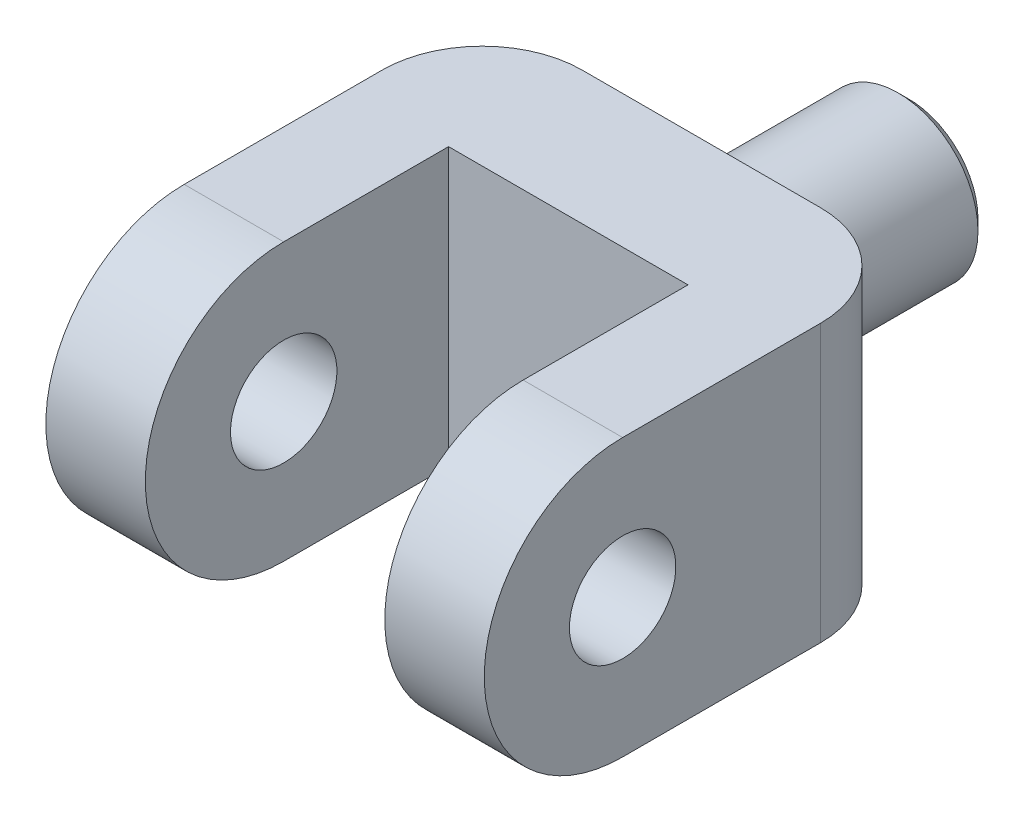
ISO-10303-21;
HEADER;
FILE_DESCRIPTION(('STEP AP214'),'2;1');
FILE_NAME('part.step','',(''),(''),'','','');
FILE_SCHEMA(('AUTOMOTIVE_DESIGN { 1 0 10303 214 1 1 1 1 }'));
ENDSEC;
DATA;
#1=APPLICATION_CONTEXT('core data for automotive mechanical design processes');
#2=APPLICATION_PROTOCOL_DEFINITION('international standard','automotive_design',2000,#1);
#3=PRODUCT_CONTEXT('',#1,'mechanical');
#4=PRODUCT('Part','Part','',(#3));
#5=PRODUCT_RELATED_PRODUCT_CATEGORY('part','',(#4));
#6=PRODUCT_DEFINITION_FORMATION('','',#4);
#7=PRODUCT_DEFINITION_CONTEXT('part definition',#1,'design');
#8=PRODUCT_DEFINITION('design','',#6,#7);
#9=PRODUCT_DEFINITION_SHAPE('','',#8);
#10=(LENGTH_UNIT() NAMED_UNIT(*) SI_UNIT(.MILLI.,.METRE.));
#11=(NAMED_UNIT(*) PLANE_ANGLE_UNIT() SI_UNIT($,.RADIAN.));
#12=(NAMED_UNIT(*) SI_UNIT($,.STERADIAN.) SOLID_ANGLE_UNIT());
#13=UNCERTAINTY_MEASURE_WITH_UNIT(LENGTH_MEASURE(1.E-05),#10,'distance_accuracy_value','');
#14=(GEOMETRIC_REPRESENTATION_CONTEXT(3) GLOBAL_UNCERTAINTY_ASSIGNED_CONTEXT((#13)) GLOBAL_UNIT_ASSIGNED_CONTEXT((#10,
#11,#12)) REPRESENTATION_CONTEXT('',''));
#15=CARTESIAN_POINT('',(0.,0.,0.));
#16=DIRECTION('',(0.,0.,1.));
#17=DIRECTION('',(1.,0.,0.));
#18=AXIS2_PLACEMENT_3D('',#15,#16,#17);
#19=CARTESIAN_POINT('',(-1.28860577238212,1.3,-0.36947040498442));
#20=DIRECTION('',(1.,0.,0.));
#21=DIRECTION('',(0.,0.,-1.));
#22=AXIS2_PLACEMENT_3D('',#19,#20,#21);
#23=CYLINDRICAL_SURFACE('',#22,1.3);
#24=DIRECTION('',(-1.,0.,0.));
#25=VECTOR('',#24,1.);
#26=CARTESIAN_POINT('',(-1.28860577238212,0.,-0.36947040498442));
#27=LINE('',#26,#25);
#28=CARTESIAN_POINT('',(-1.28860577238212,0.,-0.369470404984421));
#29=VERTEX_POINT('',#28);
#30=CARTESIAN_POINT('',(-2.22360577238212,0.,-0.36947040498442));
#31=VERTEX_POINT('',#30);
#32=EDGE_CURVE('E172',#29,#31,#27,.T.);
#33=ORIENTED_EDGE('',*,*,#32,.F.);
#34=CARTESIAN_POINT('',(-1.28860577238212,1.3,-0.36947040498442));
#35=DIRECTION('',(-1.,0.,0.));
#36=DIRECTION('',(0.,0.,1.));
#37=AXIS2_PLACEMENT_3D('',#34,#35,#36);
#38=CIRCLE('',#37,1.3);
#39=CARTESIAN_POINT('',(-1.28860577238212,2.6,-0.369470404984421));
#40=VERTEX_POINT('',#39);
#41=EDGE_CURVE('E176',#40,#29,#38,.F.);
#42=ORIENTED_EDGE('',*,*,#41,.F.);
#43=DIRECTION('',(1.,0.,0.));
#44=VECTOR('',#43,1.);
#45=CARTESIAN_POINT('',(0.,2.6,-0.369470404984421));
#46=LINE('',#45,#44);
#47=CARTESIAN_POINT('',(-2.22360577238212,2.6,-0.36947040498442));
#48=VERTEX_POINT('',#47);
#49=EDGE_CURVE('E122',#48,#40,#46,.T.);
#50=ORIENTED_EDGE('',*,*,#49,.F.);
#51=CARTESIAN_POINT('',(-2.22360577238212,1.3,-0.36947040498442));
#52=DIRECTION('',(1.,0.,0.));
#53=DIRECTION('',(0.,0.,-1.));
#54=AXIS2_PLACEMENT_3D('',#51,#52,#53);
#55=CIRCLE('',#54,1.3);
#56=EDGE_CURVE('E178',#31,#48,#55,.F.);
#57=ORIENTED_EDGE('',*,*,#56,.F.);
#58=EDGE_LOOP('',(#33,#42,#50,#57));
#59=FACE_BOUND('',#58,.T.);
#60=ADVANCED_FACE('F35',(#59),#23,.T.);
#61=CARTESIAN_POINT('',(0.961394227617876,1.3,-0.369470404984423));
#62=DIRECTION('',(1.,0.,0.));
#63=DIRECTION('',(0.,0.,-1.));
#64=AXIS2_PLACEMENT_3D('',#61,#62,#63);
#65=CYLINDRICAL_SURFACE('',#64,1.3);
#66=DIRECTION('',(1.,0.,0.));
#67=VECTOR('',#66,1.);
#68=CARTESIAN_POINT('',(0.,2.6,-0.369470404984423));
#69=LINE('',#68,#67);
#70=CARTESIAN_POINT('',(0.961394227617876,2.6,-0.369470404984423));
#71=VERTEX_POINT('',#70);
#72=CARTESIAN_POINT('',(1.89639422761788,2.6,-0.369470404984423));
#73=VERTEX_POINT('',#72);
#74=EDGE_CURVE('E133',#71,#73,#69,.T.);
#75=ORIENTED_EDGE('',*,*,#74,.F.);
#76=CARTESIAN_POINT('',(0.961394227617876,1.3,-0.369470404984423));
#77=DIRECTION('',(1.,0.,0.));
#78=DIRECTION('',(0.,0.,-1.));
#79=AXIS2_PLACEMENT_3D('',#76,#77,#78);
#80=CIRCLE('',#79,1.3);
#81=CARTESIAN_POINT('',(0.961394227617876,0.,-0.369470404984423));
#82=VERTEX_POINT('',#81);
#83=EDGE_CURVE('E168',#82,#71,#80,.F.);
#84=ORIENTED_EDGE('',*,*,#83,.F.);
#85=DIRECTION('',(-1.,0.,0.));
#86=VECTOR('',#85,1.);
#87=CARTESIAN_POINT('',(0.961394227617876,0.,-0.369470404984423));
#88=LINE('',#87,#86);
#89=CARTESIAN_POINT('',(1.89639422761788,0.,-0.369470404984423));
#90=VERTEX_POINT('',#89);
#91=EDGE_CURVE('E165',#90,#82,#88,.T.);
#92=ORIENTED_EDGE('',*,*,#91,.F.);
#93=CARTESIAN_POINT('',(1.89639422761788,1.3,-0.369470404984423));
#94=DIRECTION('',(-1.,0.,0.));
#95=DIRECTION('',(0.,0.,1.));
#96=AXIS2_PLACEMENT_3D('',#93,#94,#95);
#97=CIRCLE('',#96,1.3);
#98=EDGE_CURVE('E170',#73,#90,#97,.F.);
#99=ORIENTED_EDGE('',*,*,#98,.F.);
#100=EDGE_LOOP('',(#75,#84,#92,#99));
#101=FACE_BOUND('',#100,.T.);
#102=ADVANCED_FACE('F216',(#101),#65,.T.);
#103=CARTESIAN_POINT('',(-2.22360577238212,2.6,0.93052959501558));
#104=DIRECTION('',(1.,0.,0.));
#105=DIRECTION('',(0.,0.,-1.));
#106=AXIS2_PLACEMENT_3D('',#103,#104,#105);
#107=PLANE('',#106);
#108=CARTESIAN_POINT('',(-2.22360577238212,1.3,-0.369470404984423));
#109=DIRECTION('',(-1.,0.,0.));
#110=DIRECTION('',(0.,0.,1.));
#111=AXIS2_PLACEMENT_3D('',#108,#109,#110);
#112=CIRCLE('',#111,0.5);
#113=CARTESIAN_POINT('',(-2.22360577238212,1.3,0.130529595015577));
#114=VERTEX_POINT('',#113);
#115=EDGE_CURVE('E199',#114,#114,#112,.T.);
#116=ORIENTED_EDGE('',*,*,#115,.F.);
#117=EDGE_LOOP('',(#116));
#118=FACE_BOUND('',#117,.T.);
#119=DIRECTION('',(0.,0.,1.));
#120=VECTOR('',#119,1.);
#121=CARTESIAN_POINT('',(-2.22360577238212,2.6,0.93052959501558));
#122=LINE('',#121,#120);
#123=CARTESIAN_POINT('',(-2.22360577238212,2.6,-2.22947040498442));
#124=VERTEX_POINT('',#123);
#125=EDGE_CURVE('E124',#124,#48,#122,.T.);
#126=ORIENTED_EDGE('',*,*,#125,.F.);
#127=DIRECTION('',(0.,-1.,0.));
#128=VECTOR('',#127,1.);
#129=CARTESIAN_POINT('',(-2.22360577238212,2.6,-2.22947040498442));
#130=LINE('',#129,#128);
#131=CARTESIAN_POINT('',(-2.22360577238212,0.,-2.22947040498442));
#132=VERTEX_POINT('',#131);
#133=EDGE_CURVE('E194',#124,#132,#130,.T.);
#134=ORIENTED_EDGE('',*,*,#133,.T.);
#135=DIRECTION('',(0.,0.,1.));
#136=VECTOR('',#135,1.);
#137=CARTESIAN_POINT('',(-2.22360577238212,0.,0.93052959501558));
#138=LINE('',#137,#136);
#139=EDGE_CURVE('E148',#132,#31,#138,.T.);
#140=ORIENTED_EDGE('',*,*,#139,.T.);
#141=ORIENTED_EDGE('',*,*,#56,.T.);
#142=EDGE_LOOP('',(#126,#134,#140,#141));
#143=FACE_BOUND('',#142,.T.);
#144=ADVANCED_FACE('F222',(#118,#143),#107,.F.);
#145=CARTESIAN_POINT('',(-1.28860577238212,2.6,-1.91881619937695));
#146=DIRECTION('',(-1.,0.,0.));
#147=DIRECTION('',(0.,0.,1.));
#148=AXIS2_PLACEMENT_3D('',#145,#146,#147);
#149=PLANE('',#148);
#150=CARTESIAN_POINT('',(-1.28860577238212,1.3,-0.369470404984423));
#151=DIRECTION('',(-1.,0.,0.));
#152=DIRECTION('',(0.,0.,1.));
#153=AXIS2_PLACEMENT_3D('',#150,#151,#152);
#154=CIRCLE('',#153,0.5);
#155=CARTESIAN_POINT('',(-1.28860577238212,1.3,0.130529595015577));
#156=VERTEX_POINT('',#155);
#157=EDGE_CURVE('E150',#156,#156,#154,.T.);
#158=ORIENTED_EDGE('',*,*,#157,.T.);
#159=EDGE_LOOP('',(#158));
#160=FACE_BOUND('',#159,.T.);
#161=DIRECTION('',(0.,0.,-1.));
#162=VECTOR('',#161,1.);
#163=CARTESIAN_POINT('',(-1.28860577238212,2.6,-1.91881619937695));
#164=LINE('',#163,#162);
#165=CARTESIAN_POINT('',(-1.28860577238212,2.6,-1.91881619937695));
#166=VERTEX_POINT('',#165);
#167=EDGE_CURVE('E114',#40,#166,#164,.T.);
#168=ORIENTED_EDGE('',*,*,#167,.F.);
#169=ORIENTED_EDGE('',*,*,#41,.T.);
#170=DIRECTION('',(0.,0.,-1.));
#171=VECTOR('',#170,1.);
#172=CARTESIAN_POINT('',(-1.28860577238212,0.,-1.91881619937695));
#173=LINE('',#172,#171);
#174=CARTESIAN_POINT('',(-1.28860577238212,0.,-1.91881619937695));
#175=VERTEX_POINT('',#174);
#176=EDGE_CURVE('E130',#29,#175,#173,.T.);
#177=ORIENTED_EDGE('',*,*,#176,.T.);
#178=DIRECTION('',(0.,-1.,0.));
#179=VECTOR('',#178,1.);
#180=CARTESIAN_POINT('',(-1.28860577238212,2.6,-1.91881619937695));
#181=LINE('',#180,#179);
#182=EDGE_CURVE('E127',#166,#175,#181,.T.);
#183=ORIENTED_EDGE('',*,*,#182,.F.);
#184=EDGE_LOOP('',(#168,#169,#177,#183));
#185=FACE_BOUND('',#184,.T.);
#186=ADVANCED_FACE('F128',(#160,#185),#149,.F.);
#187=CARTESIAN_POINT('',(0.961394227617876,2.6,-1.91881619937695));
#188=DIRECTION('',(0.,0.,-1.));
#189=DIRECTION('',(-1.,0.,0.));
#190=AXIS2_PLACEMENT_3D('',#187,#188,#189);
#191=PLANE('',#190);
#192=DIRECTION('',(1.,0.,0.));
#193=VECTOR('',#192,1.);
#194=CARTESIAN_POINT('',(0.961394227617876,0.,-1.91881619937695));
#195=LINE('',#194,#193);
#196=CARTESIAN_POINT('',(0.961394227617876,0.,-1.91881619937695));
#197=VERTEX_POINT('',#196);
#198=EDGE_CURVE('E152',#175,#197,#195,.T.);
#199=ORIENTED_EDGE('',*,*,#198,.T.);
#200=DIRECTION('',(0.,-1.,0.));
#201=VECTOR('',#200,1.);
#202=CARTESIAN_POINT('',(0.961394227617876,2.6,-1.91881619937695));
#203=LINE('',#202,#201);
#204=CARTESIAN_POINT('',(0.961394227617876,2.6,-1.91881619937695));
#205=VERTEX_POINT('',#204);
#206=EDGE_CURVE('E134',#205,#197,#203,.T.);
#207=ORIENTED_EDGE('',*,*,#206,.F.);
#208=DIRECTION('',(1.,0.,0.));
#209=VECTOR('',#208,1.);
#210=CARTESIAN_POINT('',(0.961394227617876,2.6,-1.91881619937695));
#211=LINE('',#210,#209);
#212=EDGE_CURVE('E119',#166,#205,#211,.T.);
#213=ORIENTED_EDGE('',*,*,#212,.F.);
#214=ORIENTED_EDGE('',*,*,#182,.T.);
#215=EDGE_LOOP('',(#199,#207,#213,#214));
#216=FACE_BOUND('',#215,.T.);
#217=ADVANCED_FACE('F136',(#216),#191,.F.);
#218=CARTESIAN_POINT('',(0.961394227617876,2.6,0.930529595015577));
#219=DIRECTION('',(1.,0.,0.));
#220=DIRECTION('',(0.,0.,-1.));
#221=AXIS2_PLACEMENT_3D('',#218,#219,#220);
#222=PLANE('',#221);
#223=CARTESIAN_POINT('',(0.961394227617876,1.3,-0.369470404984423));
#224=DIRECTION('',(1.,0.,0.));
#225=DIRECTION('',(0.,0.,-1.));
#226=AXIS2_PLACEMENT_3D('',#223,#224,#225);
#227=CIRCLE('',#226,0.5);
#228=CARTESIAN_POINT('',(0.961394227617876,1.3,-0.869470404984423));
#229=VERTEX_POINT('',#228);
#230=EDGE_CURVE('E292',#229,#229,#227,.T.);
#231=ORIENTED_EDGE('',*,*,#230,.T.);
#232=EDGE_LOOP('',(#231));
#233=FACE_BOUND('',#232,.T.);
#234=DIRECTION('',(0.,0.,1.));
#235=VECTOR('',#234,1.);
#236=CARTESIAN_POINT('',(0.961394227617876,0.,0.930529595015577));
#237=LINE('',#236,#235);
#238=EDGE_CURVE('E154',#197,#82,#237,.T.);
#239=ORIENTED_EDGE('',*,*,#238,.T.);
#240=ORIENTED_EDGE('',*,*,#83,.T.);
#241=DIRECTION('',(0.,0.,1.));
#242=VECTOR('',#241,1.);
#243=CARTESIAN_POINT('',(0.961394227617876,2.6,0.930529595015577));
#244=LINE('',#243,#242);
#245=EDGE_CURVE('E139',#205,#71,#244,.T.);
#246=ORIENTED_EDGE('',*,*,#245,.F.);
#247=ORIENTED_EDGE('',*,*,#206,.T.);
#248=EDGE_LOOP('',(#239,#240,#246,#247));
#249=FACE_BOUND('',#248,.T.);
#250=ADVANCED_FACE('F253',(#233,#249),#222,.F.);
#251=CARTESIAN_POINT('',(1.89639422761788,2.6,-3.16947040498442));
#252=DIRECTION('',(-1.,0.,0.));
#253=DIRECTION('',(0.,0.,1.));
#254=AXIS2_PLACEMENT_3D('',#251,#252,#253);
#255=PLANE('',#254);
#256=CARTESIAN_POINT('',(1.89639422761788,1.3,-0.369470404984423));
#257=DIRECTION('',(-1.,0.,0.));
#258=DIRECTION('',(0.,0.,1.));
#259=AXIS2_PLACEMENT_3D('',#256,#257,#258);
#260=CIRCLE('',#259,0.5);
#261=CARTESIAN_POINT('',(1.89639422761788,1.3,0.130529595015577));
#262=VERTEX_POINT('',#261);
#263=EDGE_CURVE('E289',#262,#262,#260,.T.);
#264=ORIENTED_EDGE('',*,*,#263,.T.);
#265=EDGE_LOOP('',(#264));
#266=FACE_BOUND('',#265,.T.);
#267=DIRECTION('',(0.,0.,-1.));
#268=VECTOR('',#267,1.);
#269=CARTESIAN_POINT('',(1.89639422761788,0.,-3.16947040498442));
#270=LINE('',#269,#268);
#271=CARTESIAN_POINT('',(1.89639422761788,0.,-2.22947040498442));
#272=VERTEX_POINT('',#271);
#273=EDGE_CURVE('E157',#90,#272,#270,.T.);
#274=ORIENTED_EDGE('',*,*,#273,.T.);
#275=DIRECTION('',(0.,-1.,0.));
#276=VECTOR('',#275,1.);
#277=CARTESIAN_POINT('',(1.89639422761788,2.6,-2.22947040498442));
#278=LINE('',#277,#276);
#279=CARTESIAN_POINT('',(1.89639422761788,2.6,-2.22947040498442));
#280=VERTEX_POINT('',#279);
#281=EDGE_CURVE('E58',#272,#280,#278,.F.);
#282=ORIENTED_EDGE('',*,*,#281,.T.);
#283=DIRECTION('',(0.,0.,-1.));
#284=VECTOR('',#283,1.);
#285=CARTESIAN_POINT('',(1.89639422761788,2.6,-3.16947040498442));
#286=LINE('',#285,#284);
#287=EDGE_CURVE('E141',#73,#280,#286,.T.);
#288=ORIENTED_EDGE('',*,*,#287,.F.);
#289=ORIENTED_EDGE('',*,*,#98,.T.);
#290=EDGE_LOOP('',(#274,#282,#288,#289));
#291=FACE_BOUND('',#290,.T.);
#292=ADVANCED_FACE('F256',(#266,#291),#255,.F.);
#293=CARTESIAN_POINT('',(-2.22360577238212,2.6,-3.16947040498442));
#294=DIRECTION('',(0.,0.,1.));
#295=DIRECTION('',(1.,0.,0.));
#296=AXIS2_PLACEMENT_3D('',#293,#294,#295);
#297=PLANE('',#296);
#298=CARTESIAN_POINT('',(-0.163605772382124,1.3,-3.16947040498442));
#299=DIRECTION('',(0.,0.,1.));
#300=DIRECTION('',(1.,0.,0.));
#301=AXIS2_PLACEMENT_3D('',#298,#299,#300);
#302=CIRCLE('',#301,0.75);
#303=CARTESIAN_POINT('',(0.586394227617876,1.3,-3.16947040498442));
#304=VERTEX_POINT('',#303);
#305=EDGE_CURVE('E197',#304,#304,#302,.T.);
#306=ORIENTED_EDGE('',*,*,#305,.T.);
#307=EDGE_LOOP('',(#306));
#308=FACE_BOUND('',#307,.T.);
#309=DIRECTION('',(-1.,0.,0.));
#310=VECTOR('',#309,1.);
#311=CARTESIAN_POINT('',(-2.22360577238212,2.6,-3.16947040498442));
#312=LINE('',#311,#310);
#313=CARTESIAN_POINT('',(0.956394227617876,2.6,-3.16947040498442));
#314=VERTEX_POINT('',#313);
#315=CARTESIAN_POINT('',(-1.28360577238212,2.6,-3.16947040498442));
#316=VERTEX_POINT('',#315);
#317=EDGE_CURVE('E146',#314,#316,#312,.T.);
#318=ORIENTED_EDGE('',*,*,#317,.F.);
#319=DIRECTION('',(0.,-1.,0.));
#320=VECTOR('',#319,1.);
#321=CARTESIAN_POINT('',(0.956394227617876,2.6,-3.16947040498442));
#322=LINE('',#321,#320);
#323=CARTESIAN_POINT('',(0.956394227617876,0.,-3.16947040498442));
#324=VERTEX_POINT('',#323);
#325=EDGE_CURVE('E183',#314,#324,#322,.T.);
#326=ORIENTED_EDGE('',*,*,#325,.T.);
#327=DIRECTION('',(-1.,0.,0.));
#328=VECTOR('',#327,1.);
#329=CARTESIAN_POINT('',(-2.22360577238212,0.,-3.16947040498442));
#330=LINE('',#329,#328);
#331=CARTESIAN_POINT('',(-1.28360577238212,0.,-3.16947040498442));
#332=VERTEX_POINT('',#331);
#333=EDGE_CURVE('E159',#324,#332,#330,.T.);
#334=ORIENTED_EDGE('',*,*,#333,.T.);
#335=DIRECTION('',(0.,-1.,0.));
#336=VECTOR('',#335,1.);
#337=CARTESIAN_POINT('',(-1.28360577238212,2.6,-3.16947040498442));
#338=LINE('',#337,#336);
#339=EDGE_CURVE('E181',#332,#316,#338,.F.);
#340=ORIENTED_EDGE('',*,*,#339,.T.);
#341=EDGE_LOOP('',(#318,#326,#334,#340));
#342=FACE_BOUND('',#341,.T.);
#343=ADVANCED_FACE('F262',(#308,#342),#297,.F.);
#344=CARTESIAN_POINT('',(0.,2.6,0.));
#345=DIRECTION('',(0.,-1.,0.));
#346=DIRECTION('',(0.,0.,-1.));
#347=AXIS2_PLACEMENT_3D('',#344,#345,#346);
#348=PLANE('',#347);
#349=ORIENTED_EDGE('',*,*,#287,.T.);
#350=CARTESIAN_POINT('',(0.956394227617876,2.6,-2.22947040498442));
#351=DIRECTION('',(0.,-1.,0.));
#352=DIRECTION('',(0.,0.,-1.));
#353=AXIS2_PLACEMENT_3D('',#350,#351,#352);
#354=CIRCLE('',#353,0.94);
#355=EDGE_CURVE('E192',#280,#314,#354,.F.);
#356=ORIENTED_EDGE('',*,*,#355,.T.);
#357=ORIENTED_EDGE('',*,*,#317,.T.);
#358=CARTESIAN_POINT('',(-1.28360577238212,2.6,-2.22947040498442));
#359=DIRECTION('',(0.,-1.,0.));
#360=DIRECTION('',(0.,0.,-1.));
#361=AXIS2_PLACEMENT_3D('',#358,#359,#360);
#362=CIRCLE('',#361,0.94);
#363=EDGE_CURVE('E50',#316,#124,#362,.F.);
#364=ORIENTED_EDGE('',*,*,#363,.T.);
#365=ORIENTED_EDGE('',*,*,#125,.T.);
#366=ORIENTED_EDGE('',*,*,#49,.T.);
#367=ORIENTED_EDGE('',*,*,#167,.T.);
#368=ORIENTED_EDGE('',*,*,#212,.T.);
#369=ORIENTED_EDGE('',*,*,#245,.T.);
#370=ORIENTED_EDGE('',*,*,#74,.T.);
#371=EDGE_LOOP('',(#349,#356,#357,#364,#365,#366,#367,#368,#369,#370));
#372=FACE_BOUND('',#371,.T.);
#373=ADVANCED_FACE('F116',(#372),#348,.F.);
#374=CARTESIAN_POINT('',(0.,0.,0.));
#375=DIRECTION('',(0.,-1.,0.));
#376=DIRECTION('',(0.,0.,-1.));
#377=AXIS2_PLACEMENT_3D('',#374,#375,#376);
#378=PLANE('',#377);
#379=ORIENTED_EDGE('',*,*,#333,.F.);
#380=CARTESIAN_POINT('',(0.956394227617876,0.,-2.22947040498442));
#381=DIRECTION('',(0.,-1.,0.));
#382=DIRECTION('',(0.,0.,-1.));
#383=AXIS2_PLACEMENT_3D('',#380,#381,#382);
#384=CIRCLE('',#383,0.94);
#385=EDGE_CURVE('E188',#324,#272,#384,.T.);
#386=ORIENTED_EDGE('',*,*,#385,.T.);
#387=ORIENTED_EDGE('',*,*,#273,.F.);
#388=ORIENTED_EDGE('',*,*,#91,.T.);
#389=ORIENTED_EDGE('',*,*,#238,.F.);
#390=ORIENTED_EDGE('',*,*,#198,.F.);
#391=ORIENTED_EDGE('',*,*,#176,.F.);
#392=ORIENTED_EDGE('',*,*,#32,.T.);
#393=ORIENTED_EDGE('',*,*,#139,.F.);
#394=CARTESIAN_POINT('',(-1.28360577238212,0.,-2.22947040498442));
#395=DIRECTION('',(0.,-1.,0.));
#396=DIRECTION('',(0.,0.,-1.));
#397=AXIS2_PLACEMENT_3D('',#394,#395,#396);
#398=CIRCLE('',#397,0.94);
#399=EDGE_CURVE('E186',#132,#332,#398,.T.);
#400=ORIENTED_EDGE('',*,*,#399,.T.);
#401=EDGE_LOOP('',(#379,#386,#387,#388,#389,#390,#391,#392,#393,#400));
#402=FACE_BOUND('',#401,.T.);
#403=ADVANCED_FACE('F250',(#402),#378,.T.);
#404=CARTESIAN_POINT('',(1.89639422761788,1.3,-0.369470404984423));
#405=DIRECTION('',(-1.,0.,0.));
#406=DIRECTION('',(0.,0.,1.));
#407=AXIS2_PLACEMENT_3D('',#404,#405,#406);
#408=CYLINDRICAL_SURFACE('',#407,0.5);
#409=ORIENTED_EDGE('',*,*,#263,.F.);
#410=EDGE_LOOP('',(#409));
#411=FACE_BOUND('',#410,.T.);
#412=ORIENTED_EDGE('',*,*,#230,.F.);
#413=EDGE_LOOP('',(#412));
#414=FACE_BOUND('',#413,.T.);
#415=ADVANCED_FACE('F301',(#411,#414),#408,.F.);
#416=ORIENTED_EDGE('',*,*,#115,.T.);
#417=EDGE_LOOP('',(#416));
#418=FACE_BOUND('',#417,.T.);
#419=ORIENTED_EDGE('',*,*,#157,.F.);
#420=EDGE_LOOP('',(#419));
#421=FACE_BOUND('',#420,.T.);
#422=ADVANCED_FACE('F235',(#418,#421),#408,.F.);
#423=CARTESIAN_POINT('',(0.956394227617876,2.6,-2.22947040498442));
#424=DIRECTION('',(0.,-1.,0.));
#425=DIRECTION('',(0.,0.,-1.));
#426=AXIS2_PLACEMENT_3D('',#423,#424,#425);
#427=CYLINDRICAL_SURFACE('',#426,0.94);
#428=ORIENTED_EDGE('',*,*,#355,.F.);
#429=ORIENTED_EDGE('',*,*,#281,.F.);
#430=ORIENTED_EDGE('',*,*,#385,.F.);
#431=ORIENTED_EDGE('',*,*,#325,.F.);
#432=EDGE_LOOP('',(#428,#429,#430,#431));
#433=FACE_BOUND('',#432,.T.);
#434=ADVANCED_FACE('F232',(#433),#427,.T.);
#435=CARTESIAN_POINT('',(-1.28360577238212,2.6,-2.22947040498442));
#436=DIRECTION('',(0.,-1.,0.));
#437=DIRECTION('',(0.,0.,-1.));
#438=AXIS2_PLACEMENT_3D('',#435,#436,#437);
#439=CYLINDRICAL_SURFACE('',#438,0.94);
#440=ORIENTED_EDGE('',*,*,#363,.F.);
#441=ORIENTED_EDGE('',*,*,#339,.F.);
#442=ORIENTED_EDGE('',*,*,#399,.F.);
#443=ORIENTED_EDGE('',*,*,#133,.F.);
#444=EDGE_LOOP('',(#440,#441,#442,#443));
#445=FACE_BOUND('',#444,.T.);
#446=ADVANCED_FACE('F234',(#445),#439,.T.);
#447=CARTESIAN_POINT('',(-0.163605772382124,1.3,-5.11881619937695));
#448=DIRECTION('',(0.,0.,1.));
#449=DIRECTION('',(1.,0.,0.));
#450=AXIS2_PLACEMENT_3D('',#447,#448,#449);
#451=CYLINDRICAL_SURFACE('',#450,0.75);
#452=CARTESIAN_POINT('',(-0.163605772382124,1.3,-5.01881619937695));
#453=DIRECTION('',(0.,0.,1.));
#454=DIRECTION('',(1.,0.,0.));
#455=AXIS2_PLACEMENT_3D('',#452,#453,#454);
#456=CIRCLE('',#455,0.75);
#457=CARTESIAN_POINT('',(0.586394227617876,1.3,-5.01881619937695));
#458=VERTEX_POINT('',#457);
#459=EDGE_CURVE('E43',#458,#458,#456,.T.);
#460=ORIENTED_EDGE('',*,*,#459,.T.);
#461=EDGE_LOOP('',(#460));
#462=FACE_BOUND('',#461,.T.);
#463=ORIENTED_EDGE('',*,*,#305,.F.);
#464=EDGE_LOOP('',(#463));
#465=FACE_BOUND('',#464,.T.);
#466=ADVANCED_FACE('F203',(#462,#465),#451,.T.);
#467=CARTESIAN_POINT('',(-0.163605772382124,1.3,-5.11881619937695));
#468=DIRECTION('',(0.,0.,1.));
#469=DIRECTION('',(1.,0.,0.));
#470=AXIS2_PLACEMENT_3D('',#467,#468,#469);
#471=PLANE('',#470);
#472=CARTESIAN_POINT('',(-0.163605772382124,1.3,-5.11881619937695));
#473=DIRECTION('',(0.,0.,1.));
#474=DIRECTION('',(1.,0.,0.));
#475=AXIS2_PLACEMENT_3D('',#472,#473,#474);
#476=CIRCLE('',#475,0.65);
#477=CARTESIAN_POINT('',(0.486394227617876,1.3,-5.11881619937695));
#478=VERTEX_POINT('',#477);
#479=EDGE_CURVE('E11',#478,#478,#476,.F.);
#480=ORIENTED_EDGE('',*,*,#479,.T.);
#481=EDGE_LOOP('',(#480));
#482=FACE_BOUND('',#481,.T.);
#483=ADVANCED_FACE('F207',(#482),#471,.F.);
#484=CARTESIAN_POINT('',(-0.163605772382124,1.3,-5.01881619937695));
#485=DIRECTION('',(0.,0.,1.));
#486=DIRECTION('',(1.,0.,0.));
#487=AXIS2_PLACEMENT_3D('',#484,#485,#486);
#488=CONICAL_SURFACE('',#487,0.75,0.78539816339745);
#489=ORIENTED_EDGE('',*,*,#479,.F.);
#490=EDGE_LOOP('',(#489));
#491=FACE_BOUND('',#490,.T.);
#492=ORIENTED_EDGE('',*,*,#459,.F.);
#493=EDGE_LOOP('',(#492));
#494=FACE_BOUND('',#493,.T.);
#495=ADVANCED_FACE('F37',(#491,#494),#488,.T.);
#496=CLOSED_SHELL('',(#60,#102,#144,#186,#217,#250,#292,#343,#373,#403,#415,#422,#434,#446,#466,
#483,#495));
#497=MANIFOLD_SOLID_BREP('B2',#496);
#498=ADVANCED_BREP_SHAPE_REPRESENTATION('',(#18,#497),#14);
#499=SHAPE_DEFINITION_REPRESENTATION(#9,#498);
ENDSEC;
END-ISO-10303-21;
